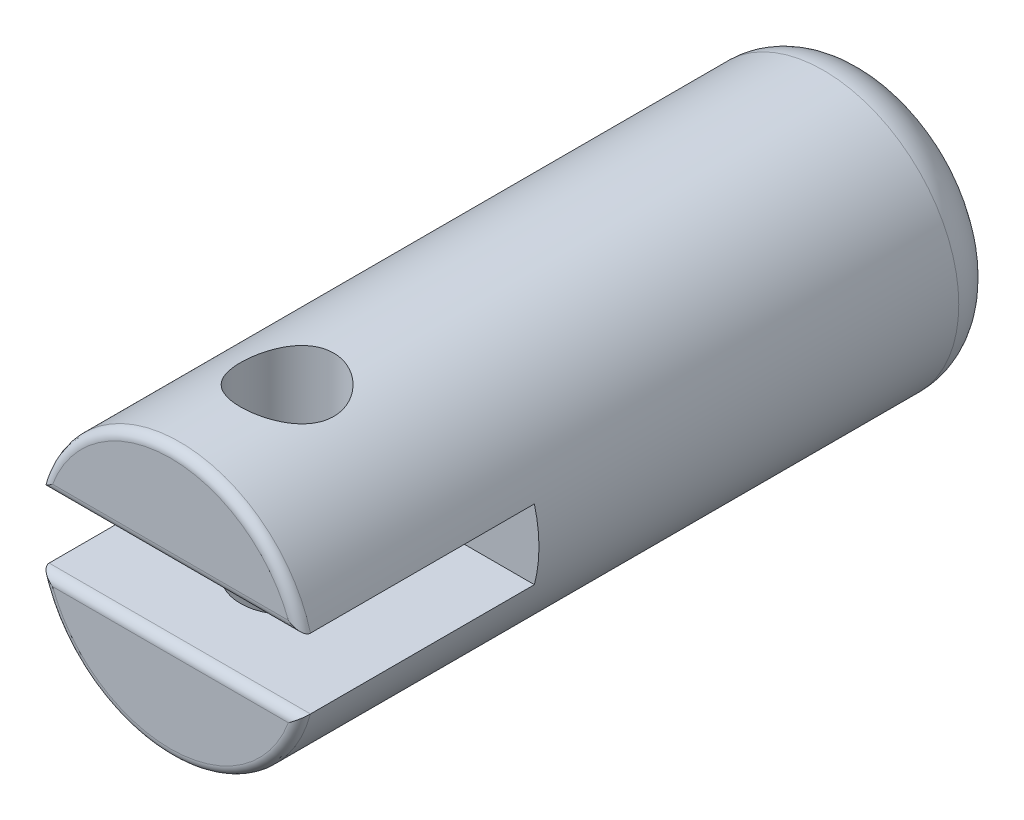
ISO-10303-21;
HEADER;
FILE_DESCRIPTION(('STEP AP214'),'2;1');
FILE_NAME('part.step','',(''),(''),'','','');
FILE_SCHEMA(('AUTOMOTIVE_DESIGN { 1 0 10303 214 1 1 1 1 }'));
ENDSEC;
DATA;
#1=APPLICATION_CONTEXT('core data for automotive mechanical design processes');
#2=APPLICATION_PROTOCOL_DEFINITION('international standard','automotive_design',2000,#1);
#3=PRODUCT_CONTEXT('',#1,'mechanical');
#4=PRODUCT('Part','Part','',(#3));
#5=PRODUCT_RELATED_PRODUCT_CATEGORY('part','',(#4));
#6=PRODUCT_DEFINITION_FORMATION('','',#4);
#7=PRODUCT_DEFINITION_CONTEXT('part definition',#1,'design');
#8=PRODUCT_DEFINITION('design','',#6,#7);
#9=PRODUCT_DEFINITION_SHAPE('','',#8);
#10=(LENGTH_UNIT() NAMED_UNIT(*) SI_UNIT(.MILLI.,.METRE.));
#11=(NAMED_UNIT(*) PLANE_ANGLE_UNIT() SI_UNIT($,.RADIAN.));
#12=(NAMED_UNIT(*) SI_UNIT($,.STERADIAN.) SOLID_ANGLE_UNIT());
#13=UNCERTAINTY_MEASURE_WITH_UNIT(LENGTH_MEASURE(1.E-05),#10,'distance_accuracy_value','');
#14=(GEOMETRIC_REPRESENTATION_CONTEXT(3) GLOBAL_UNCERTAINTY_ASSIGNED_CONTEXT((#13)) GLOBAL_UNIT_ASSIGNED_CONTEXT((#10,
#11,#12)) REPRESENTATION_CONTEXT('',''));
#15=CARTESIAN_POINT('',(0.,0.,0.));
#16=DIRECTION('',(0.,0.,1.));
#17=DIRECTION('',(1.,0.,0.));
#18=AXIS2_PLACEMENT_3D('',#15,#16,#17);
#19=CARTESIAN_POINT('',(0.,0.,15.));
#20=DIRECTION('',(0.,0.,-1.));
#21=DIRECTION('',(-1.,0.,0.));
#22=AXIS2_PLACEMENT_3D('',#19,#20,#21);
#23=CYLINDRICAL_SURFACE('',#22,2.9);
#24=CARTESIAN_POINT('',(0.,-2.9,13.5));
#25=CARTESIAN_POINT('',(0.054455213113673,-2.90000044596642,13.5000006506838));
#26=CARTESIAN_POINT('',(0.108905818143274,-2.89845224840839,13.4955376055868));
#27=CARTESIAN_POINT('',(0.216196775235785,-2.89242923061449,13.4778625828752));
#28=CARTESIAN_POINT('',(0.269037070312184,-2.88795430693165,13.4646502960131));
#29=CARTESIAN_POINT('',(0.371545174459086,-2.87656253190446,13.429988031484));
#30=CARTESIAN_POINT('',(0.421218333321002,-2.8696499345483,13.408552398701));
#31=CARTESIAN_POINT('',(0.516263627133062,-2.85408377479631,13.3581189274262));
#32=CARTESIAN_POINT('',(0.561634820702117,-2.84542983263685,13.3291194389509));
#33=CARTESIAN_POINT('',(0.64845582065183,-2.82693147875981,13.2632636165684));
#34=CARTESIAN_POINT('',(0.689725893574247,-2.8170571236675,13.2261787991691));
#35=CARTESIAN_POINT('',(0.765600385970797,-2.79739079412223,13.1456905169676));
#36=CARTESIAN_POINT('',(0.800203196229213,-2.78759884010168,13.1022855311519));
#37=CARTESIAN_POINT('',(0.86281727541276,-2.76887163076295,13.0087346333936));
#38=CARTESIAN_POINT('',(0.890589582412287,-2.75997257294439,12.9584208309678));
#39=CARTESIAN_POINT('',(0.937200454960444,-2.74449684570883,12.8534803829014));
#40=CARTESIAN_POINT('',(0.956041966482225,-2.73791941064857,12.7988551663988));
#41=CARTESIAN_POINT('',(0.98357267014441,-2.7281482054121,12.6888940930269));
#42=CARTESIAN_POINT('',(0.992600441334165,-2.72484197013287,12.6336533062527));
#43=CARTESIAN_POINT('',(1.00130604229978,-2.72165570572462,12.5223496938174));
#44=CARTESIAN_POINT('',(1.00098700566359,-2.72177452831886,12.4662871499567));
#45=CARTESIAN_POINT('',(0.991269850118853,-2.72532681352706,12.3578720761441));
#46=CARTESIAN_POINT('',(0.982320585940334,-2.72859640013378,12.3054729979967));
#47=CARTESIAN_POINT('',(0.956331839402052,-2.73781254728096,12.2029715382314));
#48=CARTESIAN_POINT('',(0.939291324321129,-2.74375944953372,12.1528694506838));
#49=CARTESIAN_POINT('',(0.897322903330796,-2.75777199360074,12.0553925860754));
#50=CARTESIAN_POINT('',(0.872266490935071,-2.76587176369009,12.0080782564944));
#51=CARTESIAN_POINT('',(0.815066789795993,-2.783263880601,11.9181869527693));
#52=CARTESIAN_POINT('',(0.782921341272506,-2.79255659050807,11.8756114283339));
#53=CARTESIAN_POINT('',(0.710327432141071,-2.81192482917279,11.7938935850986));
#54=CARTESIAN_POINT('',(0.66951422536393,-2.82201502155233,11.7550780655255));
#55=CARTESIAN_POINT('',(0.58183520574051,-2.84138718920041,11.6847538020895));
#56=CARTESIAN_POINT('',(0.534968728887011,-2.85066907561537,11.6532458608856));
#57=CARTESIAN_POINT('',(0.435783492056977,-2.86751598276309,11.5981431205474));
#58=CARTESIAN_POINT('',(0.383409250154941,-2.87506048104625,11.5746414796092));
#59=CARTESIAN_POINT('',(0.275127442528101,-2.88743285339349,11.5368857441545));
#60=CARTESIAN_POINT('',(0.219221202713811,-2.89226174023537,11.5226282017801));
#61=CARTESIAN_POINT('',(0.108224709923492,-2.89848829144024,11.5043573208626));
#62=CARTESIAN_POINT('',(0.0532152680158842,-2.90003360783231,11.4999028170645));
#63=CARTESIAN_POINT('',(-0.0567795509159969,-2.89996529704204,11.5001003588531));
#64=CARTESIAN_POINT('',(-0.111764930499342,-2.89835224583175,11.5047507440372));
#65=CARTESIAN_POINT('',(-0.218347956211725,-2.89224600856489,11.5226802857087));
#66=CARTESIAN_POINT('',(-0.269997763336054,-2.88784486957406,11.5356838525616));
#67=CARTESIAN_POINT('',(-0.37035797154155,-2.87669713597174,11.5696012524981));
#68=CARTESIAN_POINT('',(-0.419067992679719,-2.86995023894901,11.5905161055221));
#69=CARTESIAN_POINT('',(-0.513648423190477,-2.85456212899072,11.6402913717981));
#70=CARTESIAN_POINT('',(-0.559405187888157,-2.84587427954393,11.669352888655));
#71=CARTESIAN_POINT('',(-0.645533254519413,-2.82758351550565,11.7343628787572));
#72=CARTESIAN_POINT('',(-0.685902804987562,-2.81798030504744,11.7703135825733));
#73=CARTESIAN_POINT('',(-0.762163237880085,-2.79834486508445,11.8501533199339));
#74=CARTESIAN_POINT('',(-0.797739503725268,-2.78831456408555,11.8943440873839));
#75=CARTESIAN_POINT('',(-0.861016541925032,-2.76943033661311,11.9882802457092));
#76=CARTESIAN_POINT('',(-0.888717109397741,-2.76057644074627,12.0380257810418));
#77=CARTESIAN_POINT('',(-0.935361434808084,-2.74512401059867,12.1417684715318));
#78=CARTESIAN_POINT('',(-0.954311078797978,-2.73852396111492,12.1957627402098));
#79=CARTESIAN_POINT('',(-0.982752974203085,-2.72844803900345,12.3064593394323));
#80=CARTESIAN_POINT('',(-0.992249888363337,-2.72497062615665,12.3631603203585));
#81=CARTESIAN_POINT('',(-1.00113784748312,-2.72171694741471,12.4743125137619));
#82=CARTESIAN_POINT('',(-1.00105477688971,-2.72174808083967,12.5287164744906));
#83=CARTESIAN_POINT('',(-0.992093555043035,-2.72502708681539,12.6366912852419));
#84=CARTESIAN_POINT('',(-0.983216000098469,-2.72827474127043,12.6902621914996));
#85=CARTESIAN_POINT('',(-0.957300754008808,-2.73747268908473,12.7938824415463));
#86=CARTESIAN_POINT('',(-0.940444949368938,-2.74336259585187,12.8439830653223));
#87=CARTESIAN_POINT('',(-0.899202062594745,-2.75715545901479,12.9406817498066));
#88=CARTESIAN_POINT('',(-0.874813238279691,-2.76505888100725,12.9872789971772));
#89=CARTESIAN_POINT('',(-0.817886181877109,-2.78244237950148,13.0779789519227));
#90=CARTESIAN_POINT('',(-0.785024027508346,-2.79197835282225,13.1218675561536));
#91=CARTESIAN_POINT('',(-0.712618196014424,-2.81133029201349,13.2036767739813));
#92=CARTESIAN_POINT('',(-0.673072567850672,-2.82114633894552,13.2415956386316));
#93=CARTESIAN_POINT('',(-0.586391890905794,-2.84045700643123,13.3120306455316));
#94=CARTESIAN_POINT('',(-0.539004418543626,-2.84991987810608,13.3442460125275));
#95=CARTESIAN_POINT('',(-0.439168450163447,-2.86700043276143,13.4002246348399));
#96=CARTESIAN_POINT('',(-0.386720826784197,-2.87461843310318,13.423989344198));
#97=CARTESIAN_POINT('',(-0.279395305096889,-2.8870038017781,13.46182370898));
#98=CARTESIAN_POINT('',(-0.224594079770422,-2.89182903316074,13.4760911524303));
#99=CARTESIAN_POINT('',(-0.113193181266237,-2.89832638525487,13.4951774157335));
#100=CARTESIAN_POINT('',(-0.0565941020404274,-2.89999953651693,13.4999993237586));
#101=CARTESIAN_POINT('',(0.,-2.9,13.5));
#102=B_SPLINE_CURVE_WITH_KNOTS('',3,(#24,#25,#26,#27,#28,#29,#30,#31,#32,#33,#34,#35,#36,#37,
#38,#39,#40,#41,#42,#43,#44,#45,#46,#47,#48,#49,#50,#51,#52,#53,#54,#55,#56,#57,#58,#59,#60,#61,
#62,#63,#64,#65,#66,#67,#68,#69,#70,#71,#72,#73,#74,#75,#76,#77,#78,#79,#80,#81,#82,#83,#84,#85,
#86,#87,#88,#89,#90,#91,#92,#93,#94,#95,#96,#97,#98,#99,#100,#101),.UNSPECIFIED.,.T.,.F.,(4,2,2,
2,2,2,2,2,2,2,2,2,2,2,2,2,2,2,2,2,2,2,2,2,2,2,2,2,2,2,2,2,2,2,2,2,2,2,4),(0.,0.163157241751647,
0.326320250710067,0.48919992132834,0.652115152361773,0.820428202852931,0.988781826764585,
1.16238081172212,1.33592249221288,1.50326568890017,1.6705527831586,1.82958379970164,
1.98863511951579,2.1503760713389,2.31216636818928,2.48303708621215,2.65392656366623,
2.82674147346516,2.99949188973283,3.16429383665138,3.32906573245316,3.48866266177898,
3.6482801737098,3.81225002286218,3.97627305190564,4.14829884441868,4.32032911167673,
4.49224349867338,4.6640730434276,4.82647490915731,4.98886576400628,5.14772074341058,
5.30661248915597,5.47283092048882,5.63909795835676,5.81248271419456,5.98583762255759,
6.15545881175406,6.32502453485668),.UNSPECIFIED.);
#103=CARTESIAN_POINT('',(0.,-2.9,13.5));
#104=VERTEX_POINT('',#103);
#105=EDGE_CURVE('E123',#104,#104,#102,.T.);
#106=ORIENTED_EDGE('',*,*,#105,.T.);
#107=EDGE_LOOP('',(#106));
#108=FACE_BOUND('',#107,.T.);
#109=CARTESIAN_POINT('',(0.,2.9,13.5));
#110=CARTESIAN_POINT('',(-0.054455213113673,2.90000044596642,13.5000006506838));
#111=CARTESIAN_POINT('',(-0.108905818143274,2.89845224840839,13.4955376055868));
#112=CARTESIAN_POINT('',(-0.216196775235785,2.89242923061449,13.4778625828752));
#113=CARTESIAN_POINT('',(-0.269037070312184,2.88795430693165,13.4646502960131));
#114=CARTESIAN_POINT('',(-0.371545174459086,2.87656253190446,13.429988031484));
#115=CARTESIAN_POINT('',(-0.421218333321002,2.8696499345483,13.408552398701));
#116=CARTESIAN_POINT('',(-0.516263627133062,2.85408377479631,13.3581189274262));
#117=CARTESIAN_POINT('',(-0.561634820702117,2.84542983263685,13.3291194389509));
#118=CARTESIAN_POINT('',(-0.64845582065183,2.82693147875981,13.2632636165684));
#119=CARTESIAN_POINT('',(-0.689725893574247,2.8170571236675,13.2261787991691));
#120=CARTESIAN_POINT('',(-0.765600385970797,2.79739079412223,13.1456905169676));
#121=CARTESIAN_POINT('',(-0.800203196229213,2.78759884010168,13.1022855311519));
#122=CARTESIAN_POINT('',(-0.86281727541276,2.76887163076295,13.0087346333936));
#123=CARTESIAN_POINT('',(-0.890589582412287,2.75997257294439,12.9584208309678));
#124=CARTESIAN_POINT('',(-0.937200454960444,2.74449684570883,12.8534803829014));
#125=CARTESIAN_POINT('',(-0.956041966482225,2.73791941064857,12.7988551663988));
#126=CARTESIAN_POINT('',(-0.98357267014441,2.7281482054121,12.6888940930269));
#127=CARTESIAN_POINT('',(-0.992600441334165,2.72484197013287,12.6336533062527));
#128=CARTESIAN_POINT('',(-1.00130604229978,2.72165570572462,12.5223496938174));
#129=CARTESIAN_POINT('',(-1.00098700566359,2.72177452831886,12.4662871499567));
#130=CARTESIAN_POINT('',(-0.991269850118853,2.72532681352706,12.3578720761441));
#131=CARTESIAN_POINT('',(-0.982320585940334,2.72859640013378,12.3054729979967));
#132=CARTESIAN_POINT('',(-0.956331839402052,2.73781254728096,12.2029715382314));
#133=CARTESIAN_POINT('',(-0.939291324321129,2.74375944953372,12.1528694506838));
#134=CARTESIAN_POINT('',(-0.897322903330796,2.75777199360074,12.0553925860754));
#135=CARTESIAN_POINT('',(-0.872266490935071,2.76587176369009,12.0080782564944));
#136=CARTESIAN_POINT('',(-0.815066789795993,2.783263880601,11.9181869527693));
#137=CARTESIAN_POINT('',(-0.782921341272506,2.79255659050807,11.8756114283339));
#138=CARTESIAN_POINT('',(-0.710327432141071,2.81192482917279,11.7938935850986));
#139=CARTESIAN_POINT('',(-0.66951422536393,2.82201502155233,11.7550780655255));
#140=CARTESIAN_POINT('',(-0.58183520574051,2.84138718920041,11.6847538020895));
#141=CARTESIAN_POINT('',(-0.534968728887011,2.85066907561537,11.6532458608856));
#142=CARTESIAN_POINT('',(-0.435783492056977,2.86751598276309,11.5981431205474));
#143=CARTESIAN_POINT('',(-0.383409250154941,2.87506048104625,11.5746414796092));
#144=CARTESIAN_POINT('',(-0.275127442528101,2.88743285339349,11.5368857441545));
#145=CARTESIAN_POINT('',(-0.219221202713811,2.89226174023537,11.5226282017801));
#146=CARTESIAN_POINT('',(-0.108224709923492,2.89848829144024,11.5043573208626));
#147=CARTESIAN_POINT('',(-0.0532152680158842,2.90003360783231,11.4999028170645));
#148=CARTESIAN_POINT('',(0.0567795509159969,2.89996529704204,11.5001003588531));
#149=CARTESIAN_POINT('',(0.111764930499342,2.89835224583175,11.5047507440372));
#150=CARTESIAN_POINT('',(0.218347956211725,2.89224600856489,11.5226802857087));
#151=CARTESIAN_POINT('',(0.269997763336054,2.88784486957406,11.5356838525616));
#152=CARTESIAN_POINT('',(0.37035797154155,2.87669713597174,11.5696012524981));
#153=CARTESIAN_POINT('',(0.419067992679719,2.86995023894901,11.5905161055221));
#154=CARTESIAN_POINT('',(0.513648423190477,2.85456212899072,11.6402913717981));
#155=CARTESIAN_POINT('',(0.559405187888157,2.84587427954393,11.669352888655));
#156=CARTESIAN_POINT('',(0.645533254519413,2.82758351550565,11.7343628787572));
#157=CARTESIAN_POINT('',(0.685902804987562,2.81798030504744,11.7703135825733));
#158=CARTESIAN_POINT('',(0.762163237880085,2.79834486508445,11.8501533199339));
#159=CARTESIAN_POINT('',(0.797739503725268,2.78831456408555,11.8943440873839));
#160=CARTESIAN_POINT('',(0.861016541925032,2.76943033661311,11.9882802457092));
#161=CARTESIAN_POINT('',(0.888717109397741,2.76057644074627,12.0380257810418));
#162=CARTESIAN_POINT('',(0.935361434808084,2.74512401059867,12.1417684715318));
#163=CARTESIAN_POINT('',(0.954311078797978,2.73852396111492,12.1957627402098));
#164=CARTESIAN_POINT('',(0.982752974203085,2.72844803900345,12.3064593394323));
#165=CARTESIAN_POINT('',(0.992249888363337,2.72497062615665,12.3631603203585));
#166=CARTESIAN_POINT('',(1.00113784748312,2.72171694741471,12.4743125137619));
#167=CARTESIAN_POINT('',(1.00105477688971,2.72174808083967,12.5287164744906));
#168=CARTESIAN_POINT('',(0.992093555043035,2.72502708681539,12.6366912852419));
#169=CARTESIAN_POINT('',(0.983216000098469,2.72827474127043,12.6902621914996));
#170=CARTESIAN_POINT('',(0.957300754008808,2.73747268908473,12.7938824415463));
#171=CARTESIAN_POINT('',(0.940444949368938,2.74336259585187,12.8439830653223));
#172=CARTESIAN_POINT('',(0.899202062594745,2.75715545901479,12.9406817498066));
#173=CARTESIAN_POINT('',(0.874813238279691,2.76505888100725,12.9872789971772));
#174=CARTESIAN_POINT('',(0.817886181877109,2.78244237950148,13.0779789519227));
#175=CARTESIAN_POINT('',(0.785024027508346,2.79197835282225,13.1218675561536));
#176=CARTESIAN_POINT('',(0.712618196014424,2.81133029201349,13.2036767739813));
#177=CARTESIAN_POINT('',(0.673072567850672,2.82114633894552,13.2415956386316));
#178=CARTESIAN_POINT('',(0.586391890905794,2.84045700643123,13.3120306455316));
#179=CARTESIAN_POINT('',(0.539004418543626,2.84991987810608,13.3442460125275));
#180=CARTESIAN_POINT('',(0.439168450163447,2.86700043276143,13.4002246348399));
#181=CARTESIAN_POINT('',(0.386720826784197,2.87461843310318,13.423989344198));
#182=CARTESIAN_POINT('',(0.279395305096889,2.8870038017781,13.46182370898));
#183=CARTESIAN_POINT('',(0.224594079770422,2.89182903316074,13.4760911524303));
#184=CARTESIAN_POINT('',(0.113193181266237,2.89832638525487,13.4951774157335));
#185=CARTESIAN_POINT('',(0.0565941020404274,2.89999953651693,13.4999993237586));
#186=CARTESIAN_POINT('',(0.,2.9,13.5));
#187=B_SPLINE_CURVE_WITH_KNOTS('',3,(#109,#110,#111,#112,#113,#114,#115,#116,#117,#118,#119,
#120,#121,#122,#123,#124,#125,#126,#127,#128,#129,#130,#131,#132,#133,#134,#135,#136,#137,#138,
#139,#140,#141,#142,#143,#144,#145,#146,#147,#148,#149,#150,#151,#152,#153,#154,#155,#156,#157,
#158,#159,#160,#161,#162,#163,#164,#165,#166,#167,#168,#169,#170,#171,#172,#173,#174,#175,#176,
#177,#178,#179,#180,#181,#182,#183,#184,#185,#186),.UNSPECIFIED.,.T.,.F.,(4,2,2,2,2,2,2,2,2,2,2,
2,2,2,2,2,2,2,2,2,2,2,2,2,2,2,2,2,2,2,2,2,2,2,2,2,2,2,4),(0.,0.163157241751647,
0.326320250710067,0.48919992132834,0.652115152361773,0.820428202852931,0.988781826764585,
1.16238081172212,1.33592249221288,1.50326568890017,1.6705527831586,1.82958379970164,
1.98863511951579,2.1503760713389,2.31216636818928,2.48303708621215,2.65392656366623,
2.82674147346516,2.99949188973283,3.16429383665138,3.32906573245316,3.48866266177898,
3.6482801737098,3.81225002286218,3.97627305190564,4.14829884441868,4.32032911167673,
4.49224349867338,4.6640730434276,4.82647490915731,4.98886576400628,5.14772074341058,
5.30661248915597,5.47283092048882,5.63909795835676,5.81248271419456,5.98583762255759,
6.15545881175406,6.32502453485668),.UNSPECIFIED.);
#188=CARTESIAN_POINT('',(0.,2.9,13.5));
#189=VERTEX_POINT('',#188);
#190=EDGE_CURVE('E239',#189,#189,#187,.T.);
#191=ORIENTED_EDGE('',*,*,#190,.T.);
#192=EDGE_LOOP('',(#191));
#193=FACE_BOUND('',#192,.T.);
#194=CARTESIAN_POINT('',(0.,0.,1.));
#195=DIRECTION('',(0.,0.,1.));
#196=DIRECTION('',(1.,0.,0.));
#197=AXIS2_PLACEMENT_3D('',#194,#195,#196);
#198=CIRCLE('',#197,2.9);
#199=CARTESIAN_POINT('',(2.9,0.,1.));
#200=VERTEX_POINT('',#199);
#201=EDGE_CURVE('E136',#200,#200,#198,.T.);
#202=ORIENTED_EDGE('',*,*,#201,.T.);
#203=EDGE_LOOP('',(#202));
#204=FACE_BOUND('',#203,.T.);
#205=DIRECTION('',(0.,0.,-1.));
#206=VECTOR('',#205,1.);
#207=CARTESIAN_POINT('',(2.80133896556629,-0.75,15.));
#208=LINE('',#207,#206);
#209=CARTESIAN_POINT('',(2.80133896556629,-0.75,14.8));
#210=VERTEX_POINT('',#209);
#211=CARTESIAN_POINT('',(2.80133896556629,-0.75,10.));
#212=VERTEX_POINT('',#211);
#213=EDGE_CURVE('E202',#210,#212,#208,.T.);
#214=ORIENTED_EDGE('',*,*,#213,.F.);
#215=CARTESIAN_POINT('',(0.,0.,14.8));
#216=DIRECTION('',(0.,0.,1.));
#217=DIRECTION('',(1.,0.,0.));
#218=AXIS2_PLACEMENT_3D('',#215,#216,#217);
#219=CIRCLE('',#218,2.9);
#220=CARTESIAN_POINT('',(-2.80133896556629,-0.75,14.8));
#221=VERTEX_POINT('',#220);
#222=EDGE_CURVE('E159',#210,#221,#219,.F.);
#223=ORIENTED_EDGE('',*,*,#222,.T.);
#224=DIRECTION('',(0.,0.,-1.));
#225=VECTOR('',#224,1.);
#226=CARTESIAN_POINT('',(-2.80133896556629,-0.75,15.));
#227=LINE('',#226,#225);
#228=CARTESIAN_POINT('',(-2.80133896556629,-0.75,10.));
#229=VERTEX_POINT('',#228);
#230=EDGE_CURVE('E128',#229,#221,#227,.F.);
#231=ORIENTED_EDGE('',*,*,#230,.F.);
#232=CARTESIAN_POINT('',(0.,0.,10.));
#233=DIRECTION('',(0.,0.,1.));
#234=DIRECTION('',(1.,0.,0.));
#235=AXIS2_PLACEMENT_3D('',#232,#233,#234);
#236=CIRCLE('',#235,2.9);
#237=CARTESIAN_POINT('',(-2.80133896556629,0.75,10.));
#238=VERTEX_POINT('',#237);
#239=EDGE_CURVE('E118',#238,#229,#236,.T.);
#240=ORIENTED_EDGE('',*,*,#239,.F.);
#241=DIRECTION('',(0.,0.,-1.));
#242=VECTOR('',#241,1.);
#243=CARTESIAN_POINT('',(-2.80133896556629,0.75,15.));
#244=LINE('',#243,#242);
#245=CARTESIAN_POINT('',(-2.80133896556629,0.75,14.8));
#246=VERTEX_POINT('',#245);
#247=EDGE_CURVE('E101',#238,#246,#244,.F.);
#248=ORIENTED_EDGE('',*,*,#247,.T.);
#249=CARTESIAN_POINT('',(0.,0.,14.8));
#250=DIRECTION('',(0.,0.,1.));
#251=DIRECTION('',(1.,0.,0.));
#252=AXIS2_PLACEMENT_3D('',#249,#250,#251);
#253=CIRCLE('',#252,2.9);
#254=CARTESIAN_POINT('',(2.80133896556629,0.75,14.8));
#255=VERTEX_POINT('',#254);
#256=EDGE_CURVE('E156',#246,#255,#253,.F.);
#257=ORIENTED_EDGE('',*,*,#256,.T.);
#258=DIRECTION('',(0.,0.,-1.));
#259=VECTOR('',#258,1.);
#260=CARTESIAN_POINT('',(2.80133896556629,0.75,15.));
#261=LINE('',#260,#259);
#262=CARTESIAN_POINT('',(2.80133896556629,0.75,10.));
#263=VERTEX_POINT('',#262);
#264=EDGE_CURVE('E111',#255,#263,#261,.T.);
#265=ORIENTED_EDGE('',*,*,#264,.T.);
#266=EDGE_CURVE('E121',#212,#263,#236,.T.);
#267=ORIENTED_EDGE('',*,*,#266,.F.);
#268=EDGE_LOOP('',(#214,#223,#231,#240,#248,#257,#265,#267));
#269=FACE_BOUND('',#268,.T.);
#270=ADVANCED_FACE('F39',(#108,#193,#204,#269),#23,.T.);
#271=CARTESIAN_POINT('',(0.,0.,15.));
#272=DIRECTION('',(0.,0.,1.));
#273=DIRECTION('',(1.,0.,0.));
#274=AXIS2_PLACEMENT_3D('',#271,#272,#273);
#275=PLANE('',#274);
#276=CARTESIAN_POINT('',(0.,0.,15.));
#277=DIRECTION('',(0.,0.,1.));
#278=DIRECTION('',(1.,0.,0.));
#279=AXIS2_PLACEMENT_3D('',#276,#277,#278);
#280=CIRCLE('',#279,2.7);
#281=CARTESIAN_POINT('',(-2.52735039122008,-0.949999999999847,15.));
#282=VERTEX_POINT('',#281);
#283=CARTESIAN_POINT('',(2.52735039122008,-0.949999999999847,15.));
#284=VERTEX_POINT('',#283);
#285=EDGE_CURVE('E134',#282,#284,#280,.T.);
#286=ORIENTED_EDGE('',*,*,#285,.T.);
#287=DIRECTION('',(-1.,0.,0.));
#288=VECTOR('',#287,1.);
#289=CARTESIAN_POINT('',(0.,-0.95,15.));
#290=LINE('',#289,#288);
#291=EDGE_CURVE('E148',#284,#282,#290,.T.);
#292=ORIENTED_EDGE('',*,*,#291,.T.);
#293=EDGE_LOOP('',(#286,#292));
#294=FACE_BOUND('',#293,.T.);
#295=ADVANCED_FACE('F227',(#294),#275,.T.);
#296=DIRECTION('',(-1.,0.,0.));
#297=VECTOR('',#296,1.);
#298=CARTESIAN_POINT('',(2.80133896556629,0.95,15.));
#299=LINE('',#298,#297);
#300=CARTESIAN_POINT('',(-2.52735039122008,0.95,15.));
#301=VERTEX_POINT('',#300);
#302=CARTESIAN_POINT('',(2.52735039122008,0.95,15.));
#303=VERTEX_POINT('',#302);
#304=EDGE_CURVE('E61',#301,#303,#299,.F.);
#305=ORIENTED_EDGE('',*,*,#304,.T.);
#306=CARTESIAN_POINT('',(0.,0.,15.));
#307=DIRECTION('',(0.,0.,1.));
#308=DIRECTION('',(1.,0.,0.));
#309=AXIS2_PLACEMENT_3D('',#306,#307,#308);
#310=CIRCLE('',#309,2.7);
#311=EDGE_CURVE('E54',#303,#301,#310,.T.);
#312=ORIENTED_EDGE('',*,*,#311,.T.);
#313=EDGE_LOOP('',(#305,#312));
#314=FACE_BOUND('',#313,.T.);
#315=ADVANCED_FACE('F221',(#314),#275,.T.);
#316=CARTESIAN_POINT('',(0.,0.,0.));
#317=DIRECTION('',(0.,0.,1.));
#318=DIRECTION('',(1.,0.,0.));
#319=AXIS2_PLACEMENT_3D('',#316,#317,#318);
#320=PLANE('',#319);
#321=CARTESIAN_POINT('',(0.,0.,0.));
#322=DIRECTION('',(0.,0.,1.));
#323=DIRECTION('',(1.,0.,0.));
#324=AXIS2_PLACEMENT_3D('',#321,#322,#323);
#325=CIRCLE('',#324,1.9);
#326=CARTESIAN_POINT('',(1.9,0.,0.));
#327=VERTEX_POINT('',#326);
#328=EDGE_CURVE('E130',#327,#327,#325,.F.);
#329=ORIENTED_EDGE('',*,*,#328,.T.);
#330=EDGE_LOOP('',(#329));
#331=FACE_BOUND('',#330,.T.);
#332=ADVANCED_FACE('F213',(#331),#320,.F.);
#333=CARTESIAN_POINT('',(0.,0.,1.));
#334=DIRECTION('',(0.,0.,1.));
#335=DIRECTION('',(1.,0.,0.));
#336=AXIS2_PLACEMENT_3D('',#333,#334,#335);
#337=TOROIDAL_SURFACE('',#336,1.9,1.);
#338=ORIENTED_EDGE('',*,*,#328,.F.);
#339=EDGE_LOOP('',(#338));
#340=FACE_BOUND('',#339,.T.);
#341=ORIENTED_EDGE('',*,*,#201,.F.);
#342=EDGE_LOOP('',(#341));
#343=FACE_BOUND('',#342,.T.);
#344=ADVANCED_FACE('F211',(#340,#343),#337,.T.);
#345=CARTESIAN_POINT('',(0.,-0.75,10.));
#346=DIRECTION('',(0.,0.,1.));
#347=DIRECTION('',(1.,0.,0.));
#348=AXIS2_PLACEMENT_3D('',#345,#346,#347);
#349=PLANE('',#348);
#350=ORIENTED_EDGE('',*,*,#239,.T.);
#351=DIRECTION('',(1.,0.,0.));
#352=VECTOR('',#351,1.);
#353=CARTESIAN_POINT('',(0.,-0.75,10.));
#354=LINE('',#353,#352);
#355=EDGE_CURVE('E112',#229,#212,#354,.T.);
#356=ORIENTED_EDGE('',*,*,#355,.T.);
#357=ORIENTED_EDGE('',*,*,#266,.T.);
#358=DIRECTION('',(1.,0.,0.));
#359=VECTOR('',#358,1.);
#360=CARTESIAN_POINT('',(0.,0.75,10.));
#361=LINE('',#360,#359);
#362=EDGE_CURVE('E105',#238,#263,#361,.T.);
#363=ORIENTED_EDGE('',*,*,#362,.F.);
#364=EDGE_LOOP('',(#350,#356,#357,#363));
#365=FACE_BOUND('',#364,.T.);
#366=ADVANCED_FACE('F116',(#365),#349,.T.);
#367=CARTESIAN_POINT('',(0.,-0.75,0.));
#368=DIRECTION('',(0.,1.,0.));
#369=DIRECTION('',(0.,0.,1.));
#370=AXIS2_PLACEMENT_3D('',#367,#368,#369);
#371=PLANE('',#370);
#372=CARTESIAN_POINT('',(0.,-0.75,12.5));
#373=DIRECTION('',(0.,1.,0.));
#374=DIRECTION('',(0.,0.,1.));
#375=AXIS2_PLACEMENT_3D('',#372,#373,#374);
#376=CIRCLE('',#375,1.);
#377=CARTESIAN_POINT('',(0.,-0.75,13.5));
#378=VERTEX_POINT('',#377);
#379=EDGE_CURVE('E144',#378,#378,#376,.T.);
#380=ORIENTED_EDGE('',*,*,#379,.F.);
#381=EDGE_LOOP('',(#380));
#382=FACE_BOUND('',#381,.T.);
#383=ORIENTED_EDGE('',*,*,#230,.T.);
#384=DIRECTION('',(-1.,0.,0.));
#385=VECTOR('',#384,1.);
#386=CARTESIAN_POINT('',(0.,-0.75,14.8));
#387=LINE('',#386,#385);
#388=EDGE_CURVE('E152',#221,#210,#387,.F.);
#389=ORIENTED_EDGE('',*,*,#388,.T.);
#390=ORIENTED_EDGE('',*,*,#213,.T.);
#391=ORIENTED_EDGE('',*,*,#355,.F.);
#392=EDGE_LOOP('',(#383,#389,#390,#391));
#393=FACE_BOUND('',#392,.T.);
#394=ADVANCED_FACE('F219',(#382,#393),#371,.T.);
#395=CARTESIAN_POINT('',(0.,0.75,0.));
#396=DIRECTION('',(0.,1.,0.));
#397=DIRECTION('',(0.,0.,1.));
#398=AXIS2_PLACEMENT_3D('',#395,#396,#397);
#399=PLANE('',#398);
#400=CARTESIAN_POINT('',(0.,0.75,12.5));
#401=DIRECTION('',(0.,1.,0.));
#402=DIRECTION('',(0.,0.,1.));
#403=AXIS2_PLACEMENT_3D('',#400,#401,#402);
#404=CIRCLE('',#403,1.);
#405=CARTESIAN_POINT('',(0.,0.75,13.5));
#406=VERTEX_POINT('',#405);
#407=EDGE_CURVE('E140',#406,#406,#404,.T.);
#408=ORIENTED_EDGE('',*,*,#407,.T.);
#409=EDGE_LOOP('',(#408));
#410=FACE_BOUND('',#409,.T.);
#411=ORIENTED_EDGE('',*,*,#264,.F.);
#412=DIRECTION('',(-1.,0.,0.));
#413=VECTOR('',#412,1.);
#414=CARTESIAN_POINT('',(-2.80133896556629,0.75,14.8));
#415=LINE('',#414,#413);
#416=EDGE_CURVE('E11',#255,#246,#415,.T.);
#417=ORIENTED_EDGE('',*,*,#416,.T.);
#418=ORIENTED_EDGE('',*,*,#247,.F.);
#419=ORIENTED_EDGE('',*,*,#362,.T.);
#420=EDGE_LOOP('',(#411,#417,#418,#419));
#421=FACE_BOUND('',#420,.T.);
#422=ADVANCED_FACE('F104',(#410,#421),#399,.F.);
#423=CARTESIAN_POINT('',(0.,-2.9,12.5));
#424=DIRECTION('',(0.,1.,0.));
#425=DIRECTION('',(0.,0.,1.));
#426=AXIS2_PLACEMENT_3D('',#423,#424,#425);
#427=CYLINDRICAL_SURFACE('',#426,1.);
#428=ORIENTED_EDGE('',*,*,#407,.F.);
#429=EDGE_LOOP('',(#428));
#430=FACE_BOUND('',#429,.T.);
#431=ORIENTED_EDGE('',*,*,#190,.F.);
#432=EDGE_LOOP('',(#431));
#433=FACE_BOUND('',#432,.T.);
#434=ADVANCED_FACE('F254',(#430,#433),#427,.F.);
#435=ORIENTED_EDGE('',*,*,#379,.T.);
#436=EDGE_LOOP('',(#435));
#437=FACE_BOUND('',#436,.T.);
#438=ORIENTED_EDGE('',*,*,#105,.F.);
#439=EDGE_LOOP('',(#438));
#440=FACE_BOUND('',#439,.T.);
#441=ADVANCED_FACE('F185',(#437,#440),#427,.F.);
#442=CARTESIAN_POINT('',(0.,0.,14.8));
#443=DIRECTION('',(0.,0.,1.));
#444=DIRECTION('',(1.,0.,0.));
#445=AXIS2_PLACEMENT_3D('',#442,#443,#444);
#446=TOROIDAL_SURFACE('',#445,2.7,0.2);
#447=CARTESIAN_POINT('',(-2.80133896556629,-0.75,14.8));
#448=CARTESIAN_POINT('',(-2.80135856980497,-0.749984376893646,14.8082590745089));
#449=CARTESIAN_POINT('',(-2.80067380980198,-0.750510530549582,14.8164871927084));
#450=CARTESIAN_POINT('',(-2.79807407237941,-0.752504684390887,14.8325345354962));
#451=CARTESIAN_POINT('',(-2.79617343839158,-0.753961703081541,14.8403573927082));
#452=CARTESIAN_POINT('',(-2.79132352012445,-0.757673758717809,14.8554182871073));
#453=CARTESIAN_POINT('',(-2.78837870310225,-0.759925395910193,14.8626586568716));
#454=CARTESIAN_POINT('',(-2.78164322664403,-0.765064720908915,14.8765088251592));
#455=CARTESIAN_POINT('',(-2.7778499787657,-0.767954354797716,14.8831166037138));
#456=CARTESIAN_POINT('',(-2.76745192472414,-0.775855995993642,14.8989342138148));
#457=CARTESIAN_POINT('',(-2.76041406436382,-0.781187740248036,14.9076981432295));
#458=CARTESIAN_POINT('',(-2.74532087420764,-0.792571355037916,14.923747041355));
#459=CARTESIAN_POINT('',(-2.73726335811474,-0.798624771282709,14.9310287417288));
#460=CARTESIAN_POINT('',(-2.71544210088558,-0.814938738440951,14.948227821243));
#461=CARTESIAN_POINT('',(-2.70114295395867,-0.825553889391817,14.9571243049894));
#462=CARTESIAN_POINT('',(-2.67155710575095,-0.847329266543404,14.9721444888834));
#463=CARTESIAN_POINT('',(-2.65626837624083,-0.858490599990774,14.9782622741409));
#464=CARTESIAN_POINT('',(-2.62271393646893,-0.882766343417682,14.9888946721917));
#465=CARTESIAN_POINT('',(-2.60435228770883,-0.895916885838804,14.9930174499804));
#466=CARTESIAN_POINT('',(-2.56726320652308,-0.922192236243976,14.9985101807157));
#467=CARTESIAN_POINT('',(-2.54853647347727,-0.935317048846369,14.9998849577414));
#468=CARTESIAN_POINT('',(-2.52895257482018,-0.948890346119789,14.9999976813857));
#469=CARTESIAN_POINT('',(-2.52815152861936,-0.949445274094949,14.9999999883347));
#470=CARTESIAN_POINT('',(-2.52735039122002,-0.95,15.));
#471=B_SPLINE_CURVE_WITH_KNOTS('',3,(#447,#448,#449,#450,#451,#452,#453,#454,#455,#456,#457,
#458,#459,#460,#461,#462,#463,#464,#465,#466,#467,#468,#469,#470),.UNSPECIFIED.,.F.,.F.,(4,2,2,
2,2,2,2,2,2,2,2,4),(0.,0.0246831479257473,0.0490803522830265,0.0733744147017857,
0.0977436310945972,0.134854309758184,0.1720459521458,0.231435676257615,0.290951234835743,
0.359629749728275,0.428187594136594,0.431111042178805),.UNSPECIFIED.);
#472=EDGE_CURVE('E166',#221,#282,#471,.T.);
#473=ORIENTED_EDGE('',*,*,#472,.F.);
#474=ORIENTED_EDGE('',*,*,#222,.F.);
#475=CARTESIAN_POINT('',(2.80133896556629,-0.75,14.8));
#476=CARTESIAN_POINT('',(2.80135856980497,-0.749984376893646,14.8082590745089));
#477=CARTESIAN_POINT('',(2.80067380980198,-0.750510530549582,14.8164871927084));
#478=CARTESIAN_POINT('',(2.79807407237941,-0.752504684390887,14.8325345354962));
#479=CARTESIAN_POINT('',(2.79617343839158,-0.753961703081541,14.8403573927082));
#480=CARTESIAN_POINT('',(2.79132352012445,-0.757673758717809,14.8554182871073));
#481=CARTESIAN_POINT('',(2.78837870310225,-0.759925395910193,14.8626586568716));
#482=CARTESIAN_POINT('',(2.78164322664403,-0.765064720908915,14.8765088251592));
#483=CARTESIAN_POINT('',(2.7778499787657,-0.767954354797716,14.8831166037138));
#484=CARTESIAN_POINT('',(2.76745192472414,-0.775855995993642,14.8989342138148));
#485=CARTESIAN_POINT('',(2.76041406436382,-0.781187740248036,14.9076981432295));
#486=CARTESIAN_POINT('',(2.74532087420764,-0.792571355037916,14.923747041355));
#487=CARTESIAN_POINT('',(2.73726335811474,-0.798624771282709,14.9310287417288));
#488=CARTESIAN_POINT('',(2.71544210088558,-0.814938738440951,14.948227821243));
#489=CARTESIAN_POINT('',(2.70114295395867,-0.825553889391817,14.9571243049894));
#490=CARTESIAN_POINT('',(2.67155710575095,-0.847329266543404,14.9721444888834));
#491=CARTESIAN_POINT('',(2.65626837624083,-0.858490599990774,14.9782622741409));
#492=CARTESIAN_POINT('',(2.62271393646893,-0.882766343417682,14.9888946721917));
#493=CARTESIAN_POINT('',(2.60435228770883,-0.895916885838804,14.9930174499804));
#494=CARTESIAN_POINT('',(2.56726320652308,-0.922192236243976,14.9985101807157));
#495=CARTESIAN_POINT('',(2.54853647347727,-0.935317048846369,14.9998849577414));
#496=CARTESIAN_POINT('',(2.52895257482018,-0.948890346119789,14.9999976813857));
#497=CARTESIAN_POINT('',(2.52815152861936,-0.949445274094949,14.9999999883347));
#498=CARTESIAN_POINT('',(2.52735039122002,-0.95,15.));
#499=B_SPLINE_CURVE_WITH_KNOTS('',3,(#475,#476,#477,#478,#479,#480,#481,#482,#483,#484,#485,
#486,#487,#488,#489,#490,#491,#492,#493,#494,#495,#496,#497,#498),.UNSPECIFIED.,.F.,.F.,(4,2,2,
2,2,2,2,2,2,2,2,4),(0.,0.0246831479257473,0.0490803522830265,0.0733744147017857,
0.0977436310945972,0.134854309758184,0.1720459521458,0.231435676257615,0.290951234835743,
0.359629749728275,0.428187594136594,0.431111042178805),.UNSPECIFIED.);
#500=EDGE_CURVE('E145',#284,#210,#499,.F.);
#501=ORIENTED_EDGE('',*,*,#500,.F.);
#502=ORIENTED_EDGE('',*,*,#285,.F.);
#503=EDGE_LOOP('',(#473,#474,#501,#502));
#504=FACE_BOUND('',#503,.T.);
#505=ADVANCED_FACE('F182',(#504),#446,.T.);
#506=CARTESIAN_POINT('',(0.,-0.95,14.8));
#507=DIRECTION('',(-1.,0.,0.));
#508=DIRECTION('',(0.,0.,1.));
#509=AXIS2_PLACEMENT_3D('',#506,#507,#508);
#510=CYLINDRICAL_SURFACE('',#509,0.2);
#511=ORIENTED_EDGE('',*,*,#500,.T.);
#512=ORIENTED_EDGE('',*,*,#388,.F.);
#513=ORIENTED_EDGE('',*,*,#472,.T.);
#514=ORIENTED_EDGE('',*,*,#291,.F.);
#515=EDGE_LOOP('',(#511,#512,#513,#514));
#516=FACE_BOUND('',#515,.T.);
#517=ADVANCED_FACE('F179',(#516),#510,.T.);
#518=CARTESIAN_POINT('',(0.,0.95,14.8));
#519=DIRECTION('',(1.,0.,0.));
#520=DIRECTION('',(0.,0.,-1.));
#521=AXIS2_PLACEMENT_3D('',#518,#519,#520);
#522=CYLINDRICAL_SURFACE('',#521,0.2);
#523=CARTESIAN_POINT('',(-2.80133896556629,0.75,14.8));
#524=CARTESIAN_POINT('',(-2.80135856980497,0.749984376893646,14.8082590745089));
#525=CARTESIAN_POINT('',(-2.80067380980198,0.750510530549582,14.8164871927084));
#526=CARTESIAN_POINT('',(-2.79807407237941,0.752504684390887,14.8325345354962));
#527=CARTESIAN_POINT('',(-2.79617343839158,0.753961703081541,14.8403573927082));
#528=CARTESIAN_POINT('',(-2.79132352012445,0.757673758717809,14.8554182871073));
#529=CARTESIAN_POINT('',(-2.78837870310225,0.759925395910193,14.8626586568716));
#530=CARTESIAN_POINT('',(-2.78164322664403,0.765064720908915,14.8765088251592));
#531=CARTESIAN_POINT('',(-2.7778499787657,0.767954354797716,14.8831166037138));
#532=CARTESIAN_POINT('',(-2.76745192472414,0.775855995993642,14.8989342138148));
#533=CARTESIAN_POINT('',(-2.76041406436382,0.781187740248036,14.9076981432295));
#534=CARTESIAN_POINT('',(-2.74532087420764,0.792571355037916,14.923747041355));
#535=CARTESIAN_POINT('',(-2.73726335811474,0.798624771282709,14.9310287417288));
#536=CARTESIAN_POINT('',(-2.71544210088558,0.814938738440951,14.948227821243));
#537=CARTESIAN_POINT('',(-2.70114295395867,0.825553889391817,14.9571243049894));
#538=CARTESIAN_POINT('',(-2.67155710575095,0.847329266543404,14.9721444888834));
#539=CARTESIAN_POINT('',(-2.65626837624083,0.858490599990774,14.9782622741409));
#540=CARTESIAN_POINT('',(-2.62271393646893,0.882766343417682,14.9888946721917));
#541=CARTESIAN_POINT('',(-2.60435228770883,0.895916885838803,14.9930174499804));
#542=CARTESIAN_POINT('',(-2.56726320652308,0.922192236243977,14.9985101807157));
#543=CARTESIAN_POINT('',(-2.54853647347727,0.93531704884637,14.9998849577414));
#544=CARTESIAN_POINT('',(-2.52895257482018,0.948890346119789,14.9999976813857));
#545=CARTESIAN_POINT('',(-2.52815152861936,0.949445274094949,14.9999999883347));
#546=CARTESIAN_POINT('',(-2.52735039122002,0.95,15.));
#547=B_SPLINE_CURVE_WITH_KNOTS('',3,(#523,#524,#525,#526,#527,#528,#529,#530,#531,#532,#533,
#534,#535,#536,#537,#538,#539,#540,#541,#542,#543,#544,#545,#546),.UNSPECIFIED.,.F.,.F.,(4,2,2,
2,2,2,2,2,2,2,2,4),(0.,0.0246831479257473,0.0490803522830265,0.0733744147017857,
0.0977436310945972,0.134854309758184,0.1720459521458,0.231435676257615,0.290951234835743,
0.359629749728275,0.428187594136594,0.431111042178804),.UNSPECIFIED.);
#548=EDGE_CURVE('E69',#246,#301,#547,.T.);
#549=ORIENTED_EDGE('',*,*,#548,.F.);
#550=ORIENTED_EDGE('',*,*,#416,.F.);
#551=CARTESIAN_POINT('',(2.80133896556629,0.75,14.8));
#552=CARTESIAN_POINT('',(2.80135856980497,0.749984376893646,14.8082590745089));
#553=CARTESIAN_POINT('',(2.80067380980198,0.750510530549582,14.8164871927084));
#554=CARTESIAN_POINT('',(2.79807407237941,0.752504684390887,14.8325345354962));
#555=CARTESIAN_POINT('',(2.79617343839158,0.753961703081541,14.8403573927082));
#556=CARTESIAN_POINT('',(2.79132352012445,0.757673758717809,14.8554182871073));
#557=CARTESIAN_POINT('',(2.78837870310225,0.759925395910193,14.8626586568716));
#558=CARTESIAN_POINT('',(2.78164322664403,0.765064720908915,14.8765088251592));
#559=CARTESIAN_POINT('',(2.7778499787657,0.767954354797716,14.8831166037138));
#560=CARTESIAN_POINT('',(2.76745192472414,0.775855995993642,14.8989342138148));
#561=CARTESIAN_POINT('',(2.76041406436382,0.781187740248036,14.9076981432295));
#562=CARTESIAN_POINT('',(2.74532087420764,0.792571355037916,14.923747041355));
#563=CARTESIAN_POINT('',(2.73726335811474,0.798624771282709,14.9310287417288));
#564=CARTESIAN_POINT('',(2.71544210088558,0.814938738440951,14.948227821243));
#565=CARTESIAN_POINT('',(2.70114295395867,0.825553889391817,14.9571243049894));
#566=CARTESIAN_POINT('',(2.67155710575095,0.847329266543404,14.9721444888834));
#567=CARTESIAN_POINT('',(2.65626837624083,0.858490599990774,14.9782622741409));
#568=CARTESIAN_POINT('',(2.62271393646893,0.882766343417682,14.9888946721917));
#569=CARTESIAN_POINT('',(2.60435228770883,0.895916885838803,14.9930174499804));
#570=CARTESIAN_POINT('',(2.56726320652308,0.922192236243977,14.9985101807157));
#571=CARTESIAN_POINT('',(2.54853647347727,0.93531704884637,14.9998849577414));
#572=CARTESIAN_POINT('',(2.52895257482018,0.948890346119789,14.9999976813857));
#573=CARTESIAN_POINT('',(2.52815152861936,0.949445274094949,14.9999999883347));
#574=CARTESIAN_POINT('',(2.52735039122002,0.95,15.));
#575=B_SPLINE_CURVE_WITH_KNOTS('',3,(#551,#552,#553,#554,#555,#556,#557,#558,#559,#560,#561,
#562,#563,#564,#565,#566,#567,#568,#569,#570,#571,#572,#573,#574),.UNSPECIFIED.,.F.,.F.,(4,2,2,
2,2,2,2,2,2,2,2,4),(0.,0.0246831479257473,0.0490803522830265,0.0733744147017857,
0.0977436310945972,0.134854309758184,0.1720459521458,0.231435676257615,0.290951234835743,
0.359629749728275,0.428187594136594,0.431111042178804),.UNSPECIFIED.);
#576=EDGE_CURVE('E44',#303,#255,#575,.F.);
#577=ORIENTED_EDGE('',*,*,#576,.F.);
#578=ORIENTED_EDGE('',*,*,#304,.F.);
#579=EDGE_LOOP('',(#549,#550,#577,#578));
#580=FACE_BOUND('',#579,.T.);
#581=ADVANCED_FACE('F41',(#580),#522,.T.);
#582=CARTESIAN_POINT('',(0.,0.,14.8));
#583=DIRECTION('',(0.,0.,1.));
#584=DIRECTION('',(1.,0.,0.));
#585=AXIS2_PLACEMENT_3D('',#582,#583,#584);
#586=TOROIDAL_SURFACE('',#585,2.7,0.2);
#587=ORIENTED_EDGE('',*,*,#576,.T.);
#588=ORIENTED_EDGE('',*,*,#256,.F.);
#589=ORIENTED_EDGE('',*,*,#548,.T.);
#590=ORIENTED_EDGE('',*,*,#311,.F.);
#591=EDGE_LOOP('',(#587,#588,#589,#590));
#592=FACE_BOUND('',#591,.T.);
#593=ADVANCED_FACE('F187',(#592),#586,.T.);
#594=CLOSED_SHELL('',(#270,#295,#315,#332,#344,#366,#394,#422,#434,#441,#505,#517,#581,#593));
#595=MANIFOLD_SOLID_BREP('B2',#594);
#596=ADVANCED_BREP_SHAPE_REPRESENTATION('',(#18,#595),#14);
#597=SHAPE_DEFINITION_REPRESENTATION(#9,#596);
ENDSEC;
END-ISO-10303-21;
